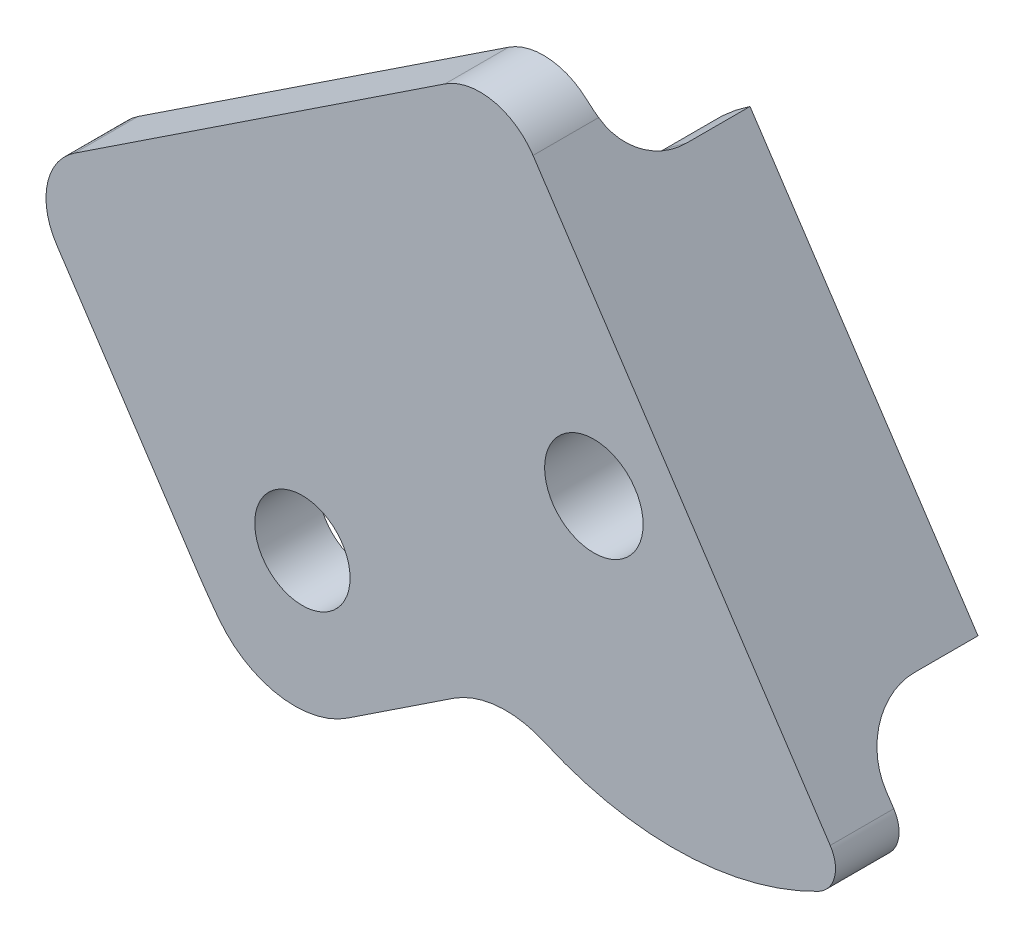
ISO-10303-21;
HEADER;
FILE_DESCRIPTION(('STEP AP214'),'2;1');
FILE_NAME('part.step','',(''),(''),'','','');
FILE_SCHEMA(('AUTOMOTIVE_DESIGN { 1 0 10303 214 1 1 1 1 }'));
ENDSEC;
DATA;
#1=APPLICATION_CONTEXT('core data for automotive mechanical design processes');
#2=APPLICATION_PROTOCOL_DEFINITION('international standard','automotive_design',2000,#1);
#3=PRODUCT_CONTEXT('',#1,'mechanical');
#4=PRODUCT('Part','Part','',(#3));
#5=PRODUCT_RELATED_PRODUCT_CATEGORY('part','',(#4));
#6=PRODUCT_DEFINITION_FORMATION('','',#4);
#7=PRODUCT_DEFINITION_CONTEXT('part definition',#1,'design');
#8=PRODUCT_DEFINITION('design','',#6,#7);
#9=PRODUCT_DEFINITION_SHAPE('','',#8);
#10=(LENGTH_UNIT() NAMED_UNIT(*) SI_UNIT(.MILLI.,.METRE.));
#11=(NAMED_UNIT(*) PLANE_ANGLE_UNIT() SI_UNIT($,.RADIAN.));
#12=(NAMED_UNIT(*) SI_UNIT($,.STERADIAN.) SOLID_ANGLE_UNIT());
#13=UNCERTAINTY_MEASURE_WITH_UNIT(LENGTH_MEASURE(1.E-05),#10,'distance_accuracy_value','');
#14=(GEOMETRIC_REPRESENTATION_CONTEXT(3) GLOBAL_UNCERTAINTY_ASSIGNED_CONTEXT((#13)) GLOBAL_UNIT_ASSIGNED_CONTEXT((#10,
#11,#12)) REPRESENTATION_CONTEXT('',''));
#15=CARTESIAN_POINT('',(0.,0.,0.));
#16=DIRECTION('',(0.,0.,1.));
#17=DIRECTION('',(1.,0.,0.));
#18=AXIS2_PLACEMENT_3D('',#15,#16,#17);
#19=CARTESIAN_POINT('',(15.0801928480776,-14.2597988169147,2.));
#20=DIRECTION('',(0.,0.,1.));
#21=DIRECTION('',(1.,0.,0.));
#22=AXIS2_PLACEMENT_3D('',#19,#20,#21);
#23=PLANE('',#22);
#24=DIRECTION('',(-0.551936985312336,0.833885822066984,0.));
#25=VECTOR('',#24,1.);
#26=CARTESIAN_POINT('',(3.52625489461526,5.0080983007631,2.));
#27=LINE('',#26,#25);
#28=CARTESIAN_POINT('',(15.914078670149,-13.7078618316025,2.));
#29=VERTEX_POINT('',#28);
#30=CARTESIAN_POINT('',(6.56190831383266,0.421726279395357,2.));
#31=VERTEX_POINT('',#30);
#32=EDGE_CURVE('E179',#29,#31,#27,.T.);
#33=ORIENTED_EDGE('',*,*,#32,.T.);
#34=CARTESIAN_POINT('',(4.89413666970067,-0.682147691228983,2.));
#35=DIRECTION('',(0.,0.,1.));
#36=DIRECTION('',(1.,0.,0.));
#37=AXIS2_PLACEMENT_3D('',#34,#35,#36);
#38=CIRCLE('',#37,2.);
#39=CARTESIAN_POINT('',(3.790262699076,0.985623952904986,2.));
#40=VERTEX_POINT('',#39);
#41=EDGE_CURVE('E246',#31,#40,#38,.T.);
#42=ORIENTED_EDGE('',*,*,#41,.T.);
#43=DIRECTION('',(0.833885822066985,0.551936985312335,0.));
#44=VECTOR('',#43,1.);
#45=CARTESIAN_POINT('',(5.45803434320768,2.08949792352814,2.));
#46=LINE('',#45,#44);
#47=CARTESIAN_POINT('',(-7.87062913389131,-6.73255198200642,2.));
#48=VERTEX_POINT('',#47);
#49=EDGE_CURVE('E324',#48,#40,#46,.T.);
#50=ORIENTED_EDGE('',*,*,#49,.F.);
#51=CARTESIAN_POINT('',(-6.76675516326664,-8.40032362614039,2.));
#52=DIRECTION('',(0.,0.,1.));
#53=DIRECTION('',(1.,0.,0.));
#54=AXIS2_PLACEMENT_3D('',#51,#52,#53);
#55=CIRCLE('',#54,2.);
#56=CARTESIAN_POINT('',(-8.43452680740061,-9.50419759676506,2.));
#57=VERTEX_POINT('',#56);
#58=EDGE_CURVE('E244',#48,#57,#55,.T.);
#59=ORIENTED_EDGE('',*,*,#58,.T.);
#60=DIRECTION('',(0.551936985312335,-0.833885822066985,0.));
#61=VECTOR('',#60,1.);
#62=CARTESIAN_POINT('',(-15.0577706311486,0.502432268038755,2.));
#63=LINE('',#62,#61);
#64=CARTESIAN_POINT('',(-4.01903092490193,-16.1752841733009,2.));
#65=VERTEX_POINT('',#64);
#66=EDGE_CURVE('E182',#57,#65,#63,.T.);
#67=ORIENTED_EDGE('',*,*,#66,.T.);
#68=CARTESIAN_POINT('',(10.9774041963778,-6.24936029721069,2.));
#69=DIRECTION('',(0.,0.,1.));
#70=DIRECTION('',(1.,0.,0.));
#71=AXIS2_PLACEMENT_3D('',#68,#69,#70);
#72=CIRCLE('',#71,17.9837991297915);
#73=CARTESIAN_POINT('',(-3.32315240221187,-17.1539974810524,2.));
#74=VERTEX_POINT('',#73);
#75=EDGE_CURVE('E185',#65,#74,#72,.T.);
#76=ORIENTED_EDGE('',*,*,#75,.T.);
#77=CARTESIAN_POINT('',(-0.937579171217196,-15.3349206933489,2.));
#78=DIRECTION('',(0.,0.,1.));
#79=DIRECTION('',(1.,0.,0.));
#80=AXIS2_PLACEMENT_3D('',#77,#78,#79);
#81=CIRCLE('',#80,2.99999999999999);
#82=CARTESIAN_POINT('',(0.718231784719807,-17.8365781595499,2.));
#83=VERTEX_POINT('',#82);
#84=EDGE_CURVE('E187',#74,#83,#81,.T.);
#85=ORIENTED_EDGE('',*,*,#84,.T.);
#86=DIRECTION('',(0.833885822066981,0.551936985312341,0.));
#87=VECTOR('',#86,1.);
#88=CARTESIAN_POINT('',(0.718231784719807,-17.8365781595499,2.));
#89=LINE('',#88,#87);
#90=CARTESIAN_POINT('',(4.05039063497953,-15.6310703289509,2.));
#91=VERTEX_POINT('',#90);
#92=EDGE_CURVE('E189',#83,#91,#89,.T.);
#93=ORIENTED_EDGE('',*,*,#92,.T.);
#94=CARTESIAN_POINT('',(5.70620159091652,-18.1327277951519,2.));
#95=DIRECTION('',(0.,0.,-1.));
#96=DIRECTION('',(1.,0.,0.));
#97=AXIS2_PLACEMENT_3D('',#94,#95,#96);
#98=CIRCLE('',#97,2.99999999999998);
#99=CARTESIAN_POINT('',(6.92263296139582,-15.3904122186885,2.));
#100=VERTEX_POINT('',#99);
#101=EDGE_CURVE('E191',#91,#100,#98,.T.);
#102=ORIENTED_EDGE('',*,*,#101,.T.);
#103=CARTESIAN_POINT('',(10.9774041963267,-6.2493602971437,2.));
#104=DIRECTION('',(0.,0.,1.));
#105=DIRECTION('',(1.,0.,0.));
#106=AXIS2_PLACEMENT_3D('',#103,#104,#105);
#107=CIRCLE('',#106,10.);
#108=CARTESIAN_POINT('',(15.5360582538287,-15.1498475413355,2.));
#109=VERTEX_POINT('',#108);
#110=EDGE_CURVE('E193',#100,#109,#107,.T.);
#111=ORIENTED_EDGE('',*,*,#110,.T.);
#112=CARTESIAN_POINT('',(15.0801928480776,-14.2597988169147,2.));
#113=DIRECTION('',(0.,0.,1.));
#114=DIRECTION('',(1.,0.,0.));
#115=AXIS2_PLACEMENT_3D('',#112,#113,#114);
#116=CIRCLE('',#115,1.00000000000361);
#117=EDGE_CURVE('E195',#109,#29,#116,.T.);
#118=ORIENTED_EDGE('',*,*,#117,.T.);
#119=EDGE_LOOP('',(#33,#42,#50,#59,#67,#76,#85,#93,#102,#111,#118));
#120=FACE_BOUND('',#119,.T.);
#121=CARTESIAN_POINT('',(-0.696997312606001,-13.9764780915139,2.));
#122=DIRECTION('',(0.,0.,1.));
#123=DIRECTION('',(1.,0.,0.));
#124=AXIS2_PLACEMENT_3D('',#121,#122,#123);
#125=CIRCLE('',#124,1.49999999999999);
#126=CARTESIAN_POINT('',(0.80300268739399,-13.9764780915139,2.));
#127=VERTEX_POINT('',#126);
#128=EDGE_CURVE('E169',#127,#127,#125,.T.);
#129=ORIENTED_EDGE('',*,*,#128,.F.);
#130=EDGE_LOOP('',(#129));
#131=FACE_BOUND('',#130,.T.);
#132=CARTESIAN_POINT('',(8.47574673013083,-7.90517125307821,2.));
#133=DIRECTION('',(0.,0.,1.));
#134=DIRECTION('',(1.,0.,0.));
#135=AXIS2_PLACEMENT_3D('',#132,#133,#134);
#136=CIRCLE('',#135,1.55000000000001);
#137=CARTESIAN_POINT('',(10.0257467301308,-7.90517125307821,2.));
#138=VERTEX_POINT('',#137);
#139=EDGE_CURVE('E174',#138,#138,#136,.T.);
#140=ORIENTED_EDGE('',*,*,#139,.F.);
#141=EDGE_LOOP('',(#140));
#142=FACE_BOUND('',#141,.T.);
#143=ADVANCED_FACE('F43',(#120,#131,#142),#23,.T.);
#144=CARTESIAN_POINT('',(15.0801928480776,-14.2597988169147,0.));
#145=DIRECTION('',(0.,0.,1.));
#146=DIRECTION('',(1.,0.,0.));
#147=AXIS2_PLACEMENT_3D('',#144,#145,#146);
#148=PLANE('',#147);
#149=DIRECTION('',(0.833885822066985,0.551936985312335,0.));
#150=VECTOR('',#149,1.);
#151=CARTESIAN_POINT('',(4.62414852113693,1.53756093821331,0.));
#152=LINE('',#151,#150);
#153=CARTESIAN_POINT('',(-7.87062913389132,-6.73255198200642,0.));
#154=VERTEX_POINT('',#153);
#155=CARTESIAN_POINT('',(3.790262699076,0.985623952904985,0.));
#156=VERTEX_POINT('',#155);
#157=EDGE_CURVE('E328',#154,#156,#152,.T.);
#158=ORIENTED_EDGE('',*,*,#157,.T.);
#159=CARTESIAN_POINT('',(4.89413666970067,-0.682147691228983,0.));
#160=DIRECTION('',(0.,0.,1.));
#161=DIRECTION('',(1.,0.,0.));
#162=AXIS2_PLACEMENT_3D('',#159,#160,#161);
#163=CIRCLE('',#162,2.);
#164=CARTESIAN_POINT('',(6.23316279877556,0.803452869370913,0.));
#165=VERTEX_POINT('',#164);
#166=EDGE_CURVE('E58',#156,#165,#163,.F.);
#167=ORIENTED_EDGE('',*,*,#166,.T.);
#168=CARTESIAN_POINT('',(10.9774041963267,-6.2493602971437,0.));
#169=DIRECTION('',(0.,0.,1.));
#170=DIRECTION('',(1.,0.,0.));
#171=AXIS2_PLACEMENT_3D('',#168,#169,#170);
#172=CIRCLE('',#171,8.5);
#173=CARTESIAN_POINT('',(15.6688685714934,-13.3373897847052,0.));
#174=VERTEX_POINT('',#173);
#175=EDGE_CURVE('E236',#165,#174,#172,.T.);
#176=ORIENTED_EDGE('',*,*,#175,.T.);
#177=DIRECTION('',(-0.551936985312676,0.833885822066759,0.));
#178=VECTOR('',#177,1.);
#179=CARTESIAN_POINT('',(6.83787680649098,0.00478336836231137,0.));
#180=LINE('',#179,#178);
#181=CARTESIAN_POINT('',(15.914078670149,-13.7078618316025,0.));
#182=VERTEX_POINT('',#181);
#183=EDGE_CURVE('E183',#182,#174,#180,.T.);
#184=ORIENTED_EDGE('',*,*,#183,.F.);
#185=CARTESIAN_POINT('',(15.0801928480776,-14.2597988169147,0.));
#186=DIRECTION('',(0.,0.,1.));
#187=DIRECTION('',(1.,0.,0.));
#188=AXIS2_PLACEMENT_3D('',#185,#186,#187);
#189=CIRCLE('',#188,1.00000000000361);
#190=CARTESIAN_POINT('',(15.5360582538287,-15.1498475413355,0.));
#191=VERTEX_POINT('',#190);
#192=EDGE_CURVE('E210',#191,#182,#189,.T.);
#193=ORIENTED_EDGE('',*,*,#192,.F.);
#194=CARTESIAN_POINT('',(10.9774041963267,-6.2493602971437,0.));
#195=DIRECTION('',(0.,0.,1.));
#196=DIRECTION('',(1.,0.,0.));
#197=AXIS2_PLACEMENT_3D('',#194,#195,#196);
#198=CIRCLE('',#197,10.);
#199=CARTESIAN_POINT('',(6.92263296139582,-15.3904122186885,0.));
#200=VERTEX_POINT('',#199);
#201=EDGE_CURVE('E208',#200,#191,#198,.T.);
#202=ORIENTED_EDGE('',*,*,#201,.F.);
#203=CARTESIAN_POINT('',(5.70620159091652,-18.1327277951519,0.));
#204=DIRECTION('',(0.,0.,-1.));
#205=DIRECTION('',(1.,0.,0.));
#206=AXIS2_PLACEMENT_3D('',#203,#204,#205);
#207=CIRCLE('',#206,2.99999999999998);
#208=CARTESIAN_POINT('',(4.05039063497953,-15.6310703289509,0.));
#209=VERTEX_POINT('',#208);
#210=EDGE_CURVE('E206',#209,#200,#207,.T.);
#211=ORIENTED_EDGE('',*,*,#210,.F.);
#212=DIRECTION('',(0.833885822066981,0.551936985312341,0.));
#213=VECTOR('',#212,1.);
#214=CARTESIAN_POINT('',(0.718231784719807,-17.8365781595499,0.));
#215=LINE('',#214,#213);
#216=CARTESIAN_POINT('',(0.718231784719807,-17.8365781595499,0.));
#217=VERTEX_POINT('',#216);
#218=EDGE_CURVE('E204',#217,#209,#215,.T.);
#219=ORIENTED_EDGE('',*,*,#218,.F.);
#220=CARTESIAN_POINT('',(-0.937579171217196,-15.3349206933489,0.));
#221=DIRECTION('',(0.,0.,1.));
#222=DIRECTION('',(1.,0.,0.));
#223=AXIS2_PLACEMENT_3D('',#220,#221,#222);
#224=CIRCLE('',#223,2.99999999999999);
#225=CARTESIAN_POINT('',(-3.32315240221187,-17.1539974810524,0.));
#226=VERTEX_POINT('',#225);
#227=EDGE_CURVE('E202',#226,#217,#224,.T.);
#228=ORIENTED_EDGE('',*,*,#227,.F.);
#229=CARTESIAN_POINT('',(10.9774041963778,-6.24936029721069,0.));
#230=DIRECTION('',(0.,0.,1.));
#231=DIRECTION('',(1.,0.,0.));
#232=AXIS2_PLACEMENT_3D('',#229,#230,#231);
#233=CIRCLE('',#232,17.9837991297915);
#234=CARTESIAN_POINT('',(-4.01903092490193,-16.1752841733009,0.));
#235=VERTEX_POINT('',#234);
#236=EDGE_CURVE('E200',#235,#226,#233,.T.);
#237=ORIENTED_EDGE('',*,*,#236,.F.);
#238=DIRECTION('',(0.551936985312335,-0.833885822066985,0.));
#239=VECTOR('',#238,1.);
#240=CARTESIAN_POINT('',(-15.0577706311486,0.502432268038755,0.));
#241=LINE('',#240,#239);
#242=CARTESIAN_POINT('',(-8.43452680740061,-9.50419759676506,0.));
#243=VERTEX_POINT('',#242);
#244=EDGE_CURVE('E178',#243,#235,#241,.T.);
#245=ORIENTED_EDGE('',*,*,#244,.F.);
#246=CARTESIAN_POINT('',(-6.76675516326664,-8.40032362614039,0.));
#247=DIRECTION('',(0.,0.,1.));
#248=DIRECTION('',(1.,0.,0.));
#249=AXIS2_PLACEMENT_3D('',#246,#247,#248);
#250=CIRCLE('',#249,2.);
#251=EDGE_CURVE('E253',#243,#154,#250,.F.);
#252=ORIENTED_EDGE('',*,*,#251,.T.);
#253=EDGE_LOOP('',(#158,#167,#176,#184,#193,#202,#211,#219,#228,#237,#245,#252));
#254=FACE_BOUND('',#253,.T.);
#255=CARTESIAN_POINT('',(-0.696997312606001,-13.9764780915139,0.));
#256=DIRECTION('',(0.,0.,1.));
#257=DIRECTION('',(1.,0.,0.));
#258=AXIS2_PLACEMENT_3D('',#255,#256,#257);
#259=CIRCLE('',#258,1.49999999999999);
#260=CARTESIAN_POINT('',(0.80300268739399,-13.9764780915139,0.));
#261=VERTEX_POINT('',#260);
#262=EDGE_CURVE('E166',#261,#261,#259,.T.);
#263=ORIENTED_EDGE('',*,*,#262,.T.);
#264=EDGE_LOOP('',(#263));
#265=FACE_BOUND('',#264,.T.);
#266=ADVANCED_FACE('F272',(#254,#265),#148,.F.);
#267=CARTESIAN_POINT('',(-15.0577706311486,0.502432268038755,2.));
#268=DIRECTION('',(0.833885822066985,0.551936985312335,0.));
#269=DIRECTION('',(-0.551936985312335,0.833885822066985,0.));
#270=AXIS2_PLACEMENT_3D('',#267,#268,#269);
#271=PLANE('',#270);
#272=ORIENTED_EDGE('',*,*,#66,.F.);
#273=DIRECTION('',(0.,0.,1.));
#274=VECTOR('',#273,1.);
#275=CARTESIAN_POINT('',(-8.43452680740061,-9.50419759676506,2.));
#276=LINE('',#275,#274);
#277=EDGE_CURVE('E11',#57,#243,#276,.F.);
#278=ORIENTED_EDGE('',*,*,#277,.T.);
#279=ORIENTED_EDGE('',*,*,#244,.T.);
#280=DIRECTION('',(0.,0.,-1.));
#281=VECTOR('',#280,1.);
#282=CARTESIAN_POINT('',(-4.01903092490193,-16.1752841733009,2.));
#283=LINE('',#282,#281);
#284=EDGE_CURVE('E231',#65,#235,#283,.T.);
#285=ORIENTED_EDGE('',*,*,#284,.F.);
#286=EDGE_LOOP('',(#272,#278,#279,#285));
#287=FACE_BOUND('',#286,.T.);
#288=ADVANCED_FACE('F268',(#287),#271,.F.);
#289=CARTESIAN_POINT('',(10.9774041963778,-6.24936029721069,2.));
#290=DIRECTION('',(0.,0.,-1.));
#291=DIRECTION('',(-1.,0.,0.));
#292=AXIS2_PLACEMENT_3D('',#289,#290,#291);
#293=CYLINDRICAL_SURFACE('',#292,17.9837991297915);
#294=ORIENTED_EDGE('',*,*,#236,.T.);
#295=DIRECTION('',(0.,0.,-1.));
#296=VECTOR('',#295,1.);
#297=CARTESIAN_POINT('',(-3.32315240221187,-17.1539974810524,2.));
#298=LINE('',#297,#296);
#299=EDGE_CURVE('E228',#74,#226,#298,.T.);
#300=ORIENTED_EDGE('',*,*,#299,.F.);
#301=ORIENTED_EDGE('',*,*,#75,.F.);
#302=ORIENTED_EDGE('',*,*,#284,.T.);
#303=EDGE_LOOP('',(#294,#300,#301,#302));
#304=FACE_BOUND('',#303,.T.);
#305=ADVANCED_FACE('F271',(#304),#293,.T.);
#306=CARTESIAN_POINT('',(-0.937579171217196,-15.3349206933489,2.));
#307=DIRECTION('',(0.,0.,-1.));
#308=DIRECTION('',(-1.,0.,0.));
#309=AXIS2_PLACEMENT_3D('',#306,#307,#308);
#310=CYLINDRICAL_SURFACE('',#309,2.99999999999999);
#311=ORIENTED_EDGE('',*,*,#227,.T.);
#312=DIRECTION('',(0.,0.,-1.));
#313=VECTOR('',#312,1.);
#314=CARTESIAN_POINT('',(0.718231784719807,-17.8365781595499,2.));
#315=LINE('',#314,#313);
#316=EDGE_CURVE('E225',#83,#217,#315,.T.);
#317=ORIENTED_EDGE('',*,*,#316,.F.);
#318=ORIENTED_EDGE('',*,*,#84,.F.);
#319=ORIENTED_EDGE('',*,*,#299,.T.);
#320=EDGE_LOOP('',(#311,#317,#318,#319));
#321=FACE_BOUND('',#320,.T.);
#322=ADVANCED_FACE('F275',(#321),#310,.T.);
#323=CARTESIAN_POINT('',(0.718231784719807,-17.8365781595499,2.));
#324=DIRECTION('',(-0.551936985312341,0.833885822066981,0.));
#325=DIRECTION('',(-0.833885822066981,-0.551936985312341,0.));
#326=AXIS2_PLACEMENT_3D('',#323,#324,#325);
#327=PLANE('',#326);
#328=ORIENTED_EDGE('',*,*,#218,.T.);
#329=DIRECTION('',(0.,0.,-1.));
#330=VECTOR('',#329,1.);
#331=CARTESIAN_POINT('',(4.05039063497953,-15.6310703289509,2.));
#332=LINE('',#331,#330);
#333=EDGE_CURVE('E222',#91,#209,#332,.T.);
#334=ORIENTED_EDGE('',*,*,#333,.F.);
#335=ORIENTED_EDGE('',*,*,#92,.F.);
#336=ORIENTED_EDGE('',*,*,#316,.T.);
#337=EDGE_LOOP('',(#328,#334,#335,#336));
#338=FACE_BOUND('',#337,.T.);
#339=ADVANCED_FACE('F279',(#338),#327,.F.);
#340=CARTESIAN_POINT('',(5.70620159091652,-18.1327277951519,2.));
#341=DIRECTION('',(0.,0.,-1.));
#342=DIRECTION('',(-1.,0.,0.));
#343=AXIS2_PLACEMENT_3D('',#340,#341,#342);
#344=CYLINDRICAL_SURFACE('',#343,2.99999999999998);
#345=ORIENTED_EDGE('',*,*,#210,.T.);
#346=DIRECTION('',(0.,0.,-1.));
#347=VECTOR('',#346,1.);
#348=CARTESIAN_POINT('',(6.92263296139582,-15.3904122186885,2.));
#349=LINE('',#348,#347);
#350=EDGE_CURVE('E219',#100,#200,#349,.T.);
#351=ORIENTED_EDGE('',*,*,#350,.F.);
#352=ORIENTED_EDGE('',*,*,#101,.F.);
#353=ORIENTED_EDGE('',*,*,#333,.T.);
#354=EDGE_LOOP('',(#345,#351,#352,#353));
#355=FACE_BOUND('',#354,.T.);
#356=ADVANCED_FACE('F283',(#355),#344,.F.);
#357=CARTESIAN_POINT('',(10.9774041963267,-6.2493602971437,2.));
#358=DIRECTION('',(0.,0.,-1.));
#359=DIRECTION('',(-1.,0.,0.));
#360=AXIS2_PLACEMENT_3D('',#357,#358,#359);
#361=CYLINDRICAL_SURFACE('',#360,10.);
#362=ORIENTED_EDGE('',*,*,#201,.T.);
#363=DIRECTION('',(0.,0.,-1.));
#364=VECTOR('',#363,1.);
#365=CARTESIAN_POINT('',(15.5360582538287,-15.1498475413355,2.));
#366=LINE('',#365,#364);
#367=EDGE_CURVE('E216',#109,#191,#366,.T.);
#368=ORIENTED_EDGE('',*,*,#367,.F.);
#369=ORIENTED_EDGE('',*,*,#110,.F.);
#370=ORIENTED_EDGE('',*,*,#350,.T.);
#371=EDGE_LOOP('',(#362,#368,#369,#370));
#372=FACE_BOUND('',#371,.T.);
#373=ADVANCED_FACE('F287',(#372),#361,.T.);
#374=CARTESIAN_POINT('',(15.0801928480776,-14.2597988169147,2.));
#375=DIRECTION('',(0.,0.,-1.));
#376=DIRECTION('',(-1.,0.,0.));
#377=AXIS2_PLACEMENT_3D('',#374,#375,#376);
#378=CYLINDRICAL_SURFACE('',#377,1.00000000000361);
#379=ORIENTED_EDGE('',*,*,#192,.T.);
#380=DIRECTION('',(0.,0.,-1.));
#381=VECTOR('',#380,1.);
#382=CARTESIAN_POINT('',(15.914078670149,-13.7078618316025,2.));
#383=LINE('',#382,#381);
#384=EDGE_CURVE('E198',#29,#182,#383,.T.);
#385=ORIENTED_EDGE('',*,*,#384,.F.);
#386=ORIENTED_EDGE('',*,*,#117,.F.);
#387=ORIENTED_EDGE('',*,*,#367,.T.);
#388=EDGE_LOOP('',(#379,#385,#386,#387));
#389=FACE_BOUND('',#388,.T.);
#390=ADVANCED_FACE('F291',(#389),#378,.T.);
#391=CARTESIAN_POINT('',(6.83787680649098,0.00478336836231137,2.));
#392=DIRECTION('',(-0.833885822066759,-0.551936985312676,0.));
#393=DIRECTION('',(0.551936985312676,-0.833885822066759,0.));
#394=AXIS2_PLACEMENT_3D('',#391,#392,#393);
#395=PLANE('',#394);
#396=CARTESIAN_POINT('',(6.28593982116897,0.838669190423753,-2.));
#397=DIRECTION('',(-0.833885822066759,-0.551936985312676,0.));
#398=DIRECTION('',(0.551936985312676,-0.833885822066759,0.));
#399=AXIS2_PLACEMENT_3D('',#396,#397,#398);
#400=CIRCLE('',#399,2.);
#401=CARTESIAN_POINT('',(7.38981379180326,-0.82910245370385,-2.));
#402=VERTEX_POINT('',#401);
#403=CARTESIAN_POINT('',(6.56190831382525,0.421726279390451,-0.0635083268962675));
#404=VERTEX_POINT('',#403);
#405=EDGE_CURVE('E238',#402,#404,#400,.T.);
#406=ORIENTED_EDGE('',*,*,#405,.T.);
#407=DIRECTION('',(0.,0.,1.));
#408=VECTOR('',#407,1.);
#409=CARTESIAN_POINT('',(6.56190831383419,0.421726279396368,2.));
#410=LINE('',#409,#408);
#411=EDGE_CURVE('E241',#404,#31,#410,.T.);
#412=ORIENTED_EDGE('',*,*,#411,.T.);
#413=ORIENTED_EDGE('',*,*,#32,.F.);
#414=ORIENTED_EDGE('',*,*,#384,.T.);
#415=ORIENTED_EDGE('',*,*,#183,.T.);
#416=CARTESIAN_POINT('',(15.6688685714845,-13.3373897847112,-2.));
#417=DIRECTION('',(-0.833885822066759,-0.551936985312676,0.));
#418=DIRECTION('',(0.551936985312676,-0.833885822066759,0.));
#419=AXIS2_PLACEMENT_3D('',#416,#417,#418);
#420=CIRCLE('',#419,2.);
#421=CARTESIAN_POINT('',(14.564994600868,-11.6696181405717,-2.));
#422=VERTEX_POINT('',#421);
#423=EDGE_CURVE('E165',#174,#422,#420,.T.);
#424=ORIENTED_EDGE('',*,*,#423,.T.);
#425=DIRECTION('',(0.,0.,1.));
#426=VECTOR('',#425,1.);
#427=CARTESIAN_POINT('',(14.564994600868,-11.6696181405717,-4.));
#428=LINE('',#427,#426);
#429=CARTESIAN_POINT('',(14.564994600868,-11.6696181405717,-4.));
#430=VERTEX_POINT('',#429);
#431=EDGE_CURVE('E149',#430,#422,#428,.T.);
#432=ORIENTED_EDGE('',*,*,#431,.F.);
#433=DIRECTION('',(0.551936985312676,-0.833885822066759,0.));
#434=VECTOR('',#433,1.);
#435=CARTESIAN_POINT('',(4.75702562067293,3.14860657256645,-4.));
#436=LINE('',#435,#434);
#437=CARTESIAN_POINT('',(7.38981379180326,-0.82910245370385,-4.));
#438=VERTEX_POINT('',#437);
#439=EDGE_CURVE('E155',#438,#430,#436,.T.);
#440=ORIENTED_EDGE('',*,*,#439,.F.);
#441=DIRECTION('',(0.,0.,1.));
#442=VECTOR('',#441,1.);
#443=CARTESIAN_POINT('',(7.38981379180326,-0.82910245370385,-4.));
#444=LINE('',#443,#442);
#445=EDGE_CURVE('E152',#438,#402,#444,.T.);
#446=ORIENTED_EDGE('',*,*,#445,.T.);
#447=EDGE_LOOP('',(#406,#412,#413,#414,#415,#424,#432,#440,#446));
#448=FACE_BOUND('',#447,.T.);
#449=ADVANCED_FACE('F162',(#448),#395,.F.);
#450=CARTESIAN_POINT('',(8.47574673013083,-7.90517125307821,2.));
#451=DIRECTION('',(0.,0.,-1.));
#452=DIRECTION('',(-1.,0.,0.));
#453=AXIS2_PLACEMENT_3D('',#450,#451,#452);
#454=CYLINDRICAL_SURFACE('',#453,1.55000000000001);
#455=ORIENTED_EDGE('',*,*,#139,.T.);
#456=EDGE_LOOP('',(#455));
#457=FACE_BOUND('',#456,.T.);
#458=CARTESIAN_POINT('',(8.47574673013083,-7.90517125307821,-4.));
#459=DIRECTION('',(0.,0.,-1.));
#460=DIRECTION('',(-1.,0.,0.));
#461=AXIS2_PLACEMENT_3D('',#458,#459,#460);
#462=CIRCLE('',#461,1.55000000000001);
#463=CARTESIAN_POINT('',(6.92574673013082,-7.90517125307821,-4.));
#464=VERTEX_POINT('',#463);
#465=EDGE_CURVE('E159',#464,#464,#462,.F.);
#466=ORIENTED_EDGE('',*,*,#465,.F.);
#467=EDGE_LOOP('',(#466));
#468=FACE_BOUND('',#467,.T.);
#469=ADVANCED_FACE('F298',(#457,#468),#454,.F.);
#470=CARTESIAN_POINT('',(-0.696997312606001,-13.9764780915139,2.));
#471=DIRECTION('',(0.,0.,-1.));
#472=DIRECTION('',(-1.,0.,0.));
#473=AXIS2_PLACEMENT_3D('',#470,#471,#472);
#474=CYLINDRICAL_SURFACE('',#473,1.49999999999999);
#475=ORIENTED_EDGE('',*,*,#262,.F.);
#476=EDGE_LOOP('',(#475));
#477=FACE_BOUND('',#476,.T.);
#478=ORIENTED_EDGE('',*,*,#128,.T.);
#479=EDGE_LOOP('',(#478));
#480=FACE_BOUND('',#479,.T.);
#481=ADVANCED_FACE('F306',(#477,#480),#474,.F.);
#482=CARTESIAN_POINT('',(10.9774041963267,-6.2493602971437,-4.));
#483=DIRECTION('',(0.,0.,1.));
#484=DIRECTION('',(1.,0.,0.));
#485=AXIS2_PLACEMENT_3D('',#482,#483,#484);
#486=CYLINDRICAL_SURFACE('',#485,6.5);
#487=ORIENTED_EDGE('',*,*,#431,.T.);
#488=CARTESIAN_POINT('',(10.9774041963267,-6.2493602971437,-2.));
#489=DIRECTION('',(0.,0.,1.));
#490=DIRECTION('',(1.,0.,0.));
#491=AXIS2_PLACEMENT_3D('',#488,#489,#490);
#492=CIRCLE('',#491,6.5);
#493=EDGE_CURVE('E234',#422,#402,#492,.F.);
#494=ORIENTED_EDGE('',*,*,#493,.T.);
#495=ORIENTED_EDGE('',*,*,#445,.F.);
#496=CARTESIAN_POINT('',(10.9774041963267,-6.2493602971437,-4.));
#497=DIRECTION('',(0.,0.,-1.));
#498=DIRECTION('',(-1.,0.,0.));
#499=AXIS2_PLACEMENT_3D('',#496,#497,#498);
#500=CIRCLE('',#499,6.5);
#501=EDGE_CURVE('E144',#430,#438,#500,.T.);
#502=ORIENTED_EDGE('',*,*,#501,.F.);
#503=EDGE_LOOP('',(#487,#494,#495,#502));
#504=FACE_BOUND('',#503,.T.);
#505=ADVANCED_FACE('F146',(#504),#486,.T.);
#506=CARTESIAN_POINT('',(0.,0.,-4.));
#507=DIRECTION('',(0.,0.,-1.));
#508=DIRECTION('',(-1.,0.,0.));
#509=AXIS2_PLACEMENT_3D('',#506,#507,#508);
#510=PLANE('',#509);
#511=ORIENTED_EDGE('',*,*,#465,.T.);
#512=EDGE_LOOP('',(#511));
#513=FACE_BOUND('',#512,.T.);
#514=ORIENTED_EDGE('',*,*,#439,.T.);
#515=ORIENTED_EDGE('',*,*,#501,.T.);
#516=EDGE_LOOP('',(#514,#515));
#517=FACE_BOUND('',#516,.T.);
#518=ADVANCED_FACE('F157',(#513,#517),#510,.T.);
#519=CARTESIAN_POINT('',(10.9774041963267,-6.2493602971437,-2.));
#520=DIRECTION('',(0.,0.,1.));
#521=DIRECTION('',(1.,0.,0.));
#522=AXIS2_PLACEMENT_3D('',#519,#520,#521);
#523=TOROIDAL_SURFACE('',#522,8.5,2.);
#524=ORIENTED_EDGE('',*,*,#175,.F.);
#525=CARTESIAN_POINT('',(6.23316279877556,0.803452869370913,0.));
#526=CARTESIAN_POINT('',(6.26489058065669,0.774867894546196,8.11308575480562E-06));
#527=CARTESIAN_POINT('',(6.29569254700822,0.745251129051052,-0.00128718335875413));
#528=CARTESIAN_POINT('',(6.35499916619263,0.684475913638245,-0.0065222037784931));
#529=CARTESIAN_POINT('',(6.38352002171791,0.653331465078838,-0.0104409908598644));
#530=CARTESIAN_POINT('',(6.43832555613378,0.589563109888962,-0.0209587837895801));
#531=CARTESIAN_POINT('',(6.46461024590667,0.556939210459435,-0.0275577765937856));
#532=CARTESIAN_POINT('',(6.51500445975493,0.490267124827465,-0.0434793263649662));
#533=CARTESIAN_POINT('',(6.53909503102062,0.456209677811906,-0.0528231175684413));
#534=CARTESIAN_POINT('',(6.56190831383419,0.421726279396369,-0.0635083268962668));
#535=B_SPLINE_CURVE_WITH_KNOTS('',3,(#525,#526,#527,#528,#529,#530,#531,#532,#533,#534),
.UNSPECIFIED.,.F.,.F.,(4,2,2,2,4),(0.,0.128078510376042,0.255146878983315,0.382214629176274,
0.510292518209427),.UNSPECIFIED.);
#536=EDGE_CURVE('E51',#165,#404,#535,.T.);
#537=ORIENTED_EDGE('',*,*,#536,.T.);
#538=ORIENTED_EDGE('',*,*,#405,.F.);
#539=ORIENTED_EDGE('',*,*,#493,.F.);
#540=ORIENTED_EDGE('',*,*,#423,.F.);
#541=EDGE_LOOP('',(#524,#537,#538,#539,#540));
#542=FACE_BOUND('',#541,.T.);
#543=ADVANCED_FACE('F262',(#542),#523,.F.);
#544=CARTESIAN_POINT('',(5.45803434320768,2.08949792352814,-8.));
#545=DIRECTION('',(0.551936985312335,-0.833885822066985,0.));
#546=DIRECTION('',(0.833885822066985,0.551936985312335,0.));
#547=AXIS2_PLACEMENT_3D('',#544,#545,#546);
#548=PLANE('',#547);
#549=ORIENTED_EDGE('',*,*,#49,.T.);
#550=DIRECTION('',(0.,0.,1.));
#551=VECTOR('',#550,1.);
#552=CARTESIAN_POINT('',(3.790262699076,0.985623952904986,-8.));
#553=LINE('',#552,#551);
#554=EDGE_CURVE('E251',#40,#156,#553,.F.);
#555=ORIENTED_EDGE('',*,*,#554,.T.);
#556=ORIENTED_EDGE('',*,*,#157,.F.);
#557=DIRECTION('',(0.,0.,1.));
#558=VECTOR('',#557,1.);
#559=CARTESIAN_POINT('',(-7.87062913389132,-6.73255198200642,-8.));
#560=LINE('',#559,#558);
#561=EDGE_CURVE('E248',#154,#48,#560,.T.);
#562=ORIENTED_EDGE('',*,*,#561,.T.);
#563=EDGE_LOOP('',(#549,#555,#556,#562));
#564=FACE_BOUND('',#563,.T.);
#565=ADVANCED_FACE('F266',(#564),#548,.F.);
#566=CARTESIAN_POINT('',(4.89413666970067,-0.682147691228983,2.));
#567=DIRECTION('',(0.,0.,1.));
#568=DIRECTION('',(1.,0.,0.));
#569=AXIS2_PLACEMENT_3D('',#566,#567,#568);
#570=CYLINDRICAL_SURFACE('',#569,2.);
#571=ORIENTED_EDGE('',*,*,#166,.F.);
#572=ORIENTED_EDGE('',*,*,#554,.F.);
#573=ORIENTED_EDGE('',*,*,#41,.F.);
#574=ORIENTED_EDGE('',*,*,#411,.F.);
#575=ORIENTED_EDGE('',*,*,#536,.F.);
#576=EDGE_LOOP('',(#571,#572,#573,#574,#575));
#577=FACE_BOUND('',#576,.T.);
#578=ADVANCED_FACE('F260',(#577),#570,.T.);
#579=CARTESIAN_POINT('',(-6.76675516326664,-8.40032362614039,-8.));
#580=DIRECTION('',(0.,0.,1.));
#581=DIRECTION('',(1.,0.,0.));
#582=AXIS2_PLACEMENT_3D('',#579,#580,#581);
#583=CYLINDRICAL_SURFACE('',#582,2.);
#584=ORIENTED_EDGE('',*,*,#251,.F.);
#585=ORIENTED_EDGE('',*,*,#277,.F.);
#586=ORIENTED_EDGE('',*,*,#58,.F.);
#587=ORIENTED_EDGE('',*,*,#561,.F.);
#588=EDGE_LOOP('',(#584,#585,#586,#587));
#589=FACE_BOUND('',#588,.T.);
#590=ADVANCED_FACE('F45',(#589),#583,.T.);
#591=CLOSED_SHELL('',(#143,#266,#288,#305,#322,#339,#356,#373,#390,#449,#469,#481,#505,#518,
#543,#565,#578,#590));
#592=MANIFOLD_SOLID_BREP('B2',#591);
#593=ADVANCED_BREP_SHAPE_REPRESENTATION('',(#18,#592),#14);
#594=SHAPE_DEFINITION_REPRESENTATION(#9,#593);
ENDSEC;
END-ISO-10303-21;
